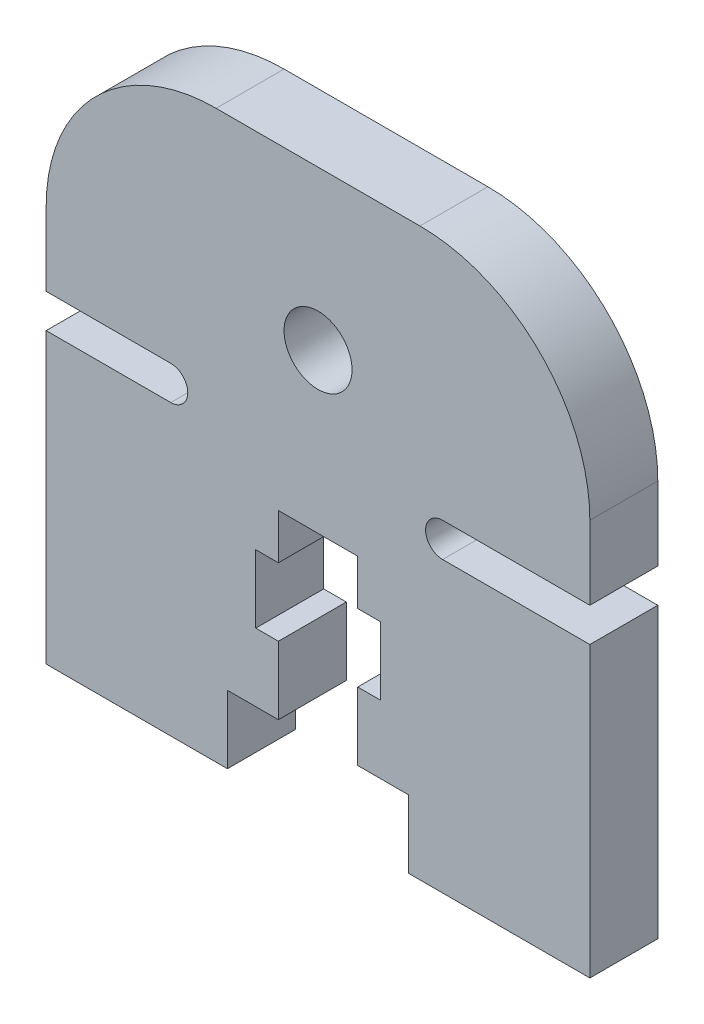
ISO-10303-21;
HEADER;
FILE_DESCRIPTION(('STEP AP214'),'2;1');
FILE_NAME('part.step','',(''),(''),'','','');
FILE_SCHEMA(('AUTOMOTIVE_DESIGN { 1 0 10303 214 1 1 1 1 }'));
ENDSEC;
DATA;
#1=APPLICATION_CONTEXT('core data for automotive mechanical design processes');
#2=APPLICATION_PROTOCOL_DEFINITION('international standard','automotive_design',2000,#1);
#3=PRODUCT_CONTEXT('',#1,'mechanical');
#4=PRODUCT('Part','Part','',(#3));
#5=PRODUCT_RELATED_PRODUCT_CATEGORY('part','',(#4));
#6=PRODUCT_DEFINITION_FORMATION('','',#4);
#7=PRODUCT_DEFINITION_CONTEXT('part definition',#1,'design');
#8=PRODUCT_DEFINITION('design','',#6,#7);
#9=PRODUCT_DEFINITION_SHAPE('','',#8);
#10=(LENGTH_UNIT() NAMED_UNIT(*) SI_UNIT(.MILLI.,.METRE.));
#11=(NAMED_UNIT(*) PLANE_ANGLE_UNIT() SI_UNIT($,.RADIAN.));
#12=(NAMED_UNIT(*) SI_UNIT($,.STERADIAN.) SOLID_ANGLE_UNIT());
#13=UNCERTAINTY_MEASURE_WITH_UNIT(LENGTH_MEASURE(1.E-05),#10,'distance_accuracy_value','');
#14=(GEOMETRIC_REPRESENTATION_CONTEXT(3) GLOBAL_UNCERTAINTY_ASSIGNED_CONTEXT((#13)) GLOBAL_UNIT_ASSIGNED_CONTEXT((#10,
#11,#12)) REPRESENTATION_CONTEXT('',''));
#15=CARTESIAN_POINT('',(0.,0.,0.));
#16=DIRECTION('',(0.,0.,1.));
#17=DIRECTION('',(1.,0.,0.));
#18=AXIS2_PLACEMENT_3D('',#15,#16,#17);
#19=CARTESIAN_POINT('',(0.,0.,3.));
#20=DIRECTION('',(0.,0.,-1.));
#21=DIRECTION('',(-1.,0.,0.));
#22=AXIS2_PLACEMENT_3D('',#19,#20,#21);
#23=PLANE('',#22);
#24=CARTESIAN_POINT('',(12.,18.,3.));
#25=DIRECTION('',(0.,0.,1.));
#26=DIRECTION('',(1.,0.,0.));
#27=AXIS2_PLACEMENT_3D('',#24,#25,#26);
#28=CIRCLE('',#27,1.5);
#29=CARTESIAN_POINT('',(13.5,18.,3.));
#30=VERTEX_POINT('',#29);
#31=EDGE_CURVE('E558',#30,#30,#28,.T.);
#32=ORIENTED_EDGE('',*,*,#31,.F.);
#33=EDGE_LOOP('',(#32));
#34=FACE_BOUND('',#33,.T.);
#35=DIRECTION('',(1.,0.,0.));
#36=VECTOR('',#35,1.);
#37=CARTESIAN_POINT('',(-5.5,14.25,3.));
#38=LINE('',#37,#36);
#39=CARTESIAN_POINT('',(0.,14.25,3.));
#40=VERTEX_POINT('',#39);
#41=CARTESIAN_POINT('',(5.5,14.25,3.));
#42=VERTEX_POINT('',#41);
#43=EDGE_CURVE('E238',#40,#42,#38,.T.);
#44=ORIENTED_EDGE('',*,*,#43,.T.);
#45=CARTESIAN_POINT('',(5.5,13.5,3.));
#46=DIRECTION('',(0.,0.,1.));
#47=DIRECTION('',(1.,0.,0.));
#48=AXIS2_PLACEMENT_3D('',#45,#46,#47);
#49=CIRCLE('',#48,0.750000000000001);
#50=CARTESIAN_POINT('',(5.5,12.75,3.));
#51=VERTEX_POINT('',#50);
#52=EDGE_CURVE('E251',#51,#42,#49,.T.);
#53=ORIENTED_EDGE('',*,*,#52,.F.);
#54=DIRECTION('',(1.,0.,0.));
#55=VECTOR('',#54,1.);
#56=CARTESIAN_POINT('',(-5.5,12.75,3.));
#57=LINE('',#56,#55);
#58=CARTESIAN_POINT('',(0.,12.75,3.));
#59=VERTEX_POINT('',#58);
#60=EDGE_CURVE('E360',#59,#51,#57,.T.);
#61=ORIENTED_EDGE('',*,*,#60,.F.);
#62=DIRECTION('',(0.,-1.,0.));
#63=VECTOR('',#62,1.);
#64=CARTESIAN_POINT('',(0.,0.,3.));
#65=LINE('',#64,#63);
#66=CARTESIAN_POINT('',(0.,0.,3.));
#67=VERTEX_POINT('',#66);
#68=EDGE_CURVE('E270',#59,#67,#65,.T.);
#69=ORIENTED_EDGE('',*,*,#68,.T.);
#70=DIRECTION('',(1.,0.,0.));
#71=VECTOR('',#70,1.);
#72=CARTESIAN_POINT('',(0.,0.,3.));
#73=LINE('',#72,#71);
#74=CARTESIAN_POINT('',(8.,0.,3.));
#75=VERTEX_POINT('',#74);
#76=EDGE_CURVE('E275',#67,#75,#73,.T.);
#77=ORIENTED_EDGE('',*,*,#76,.T.);
#78=DIRECTION('',(0.,1.,0.));
#79=VECTOR('',#78,1.);
#80=CARTESIAN_POINT('',(8.,0.,3.));
#81=LINE('',#80,#79);
#82=CARTESIAN_POINT('',(8.,3.,3.));
#83=VERTEX_POINT('',#82);
#84=EDGE_CURVE('E533',#75,#83,#81,.T.);
#85=ORIENTED_EDGE('',*,*,#84,.T.);
#86=DIRECTION('',(1.,0.,0.));
#87=VECTOR('',#86,1.);
#88=CARTESIAN_POINT('',(8.,3.,3.));
#89=LINE('',#88,#87);
#90=CARTESIAN_POINT('',(10.25,3.,3.));
#91=VERTEX_POINT('',#90);
#92=EDGE_CURVE('E538',#83,#91,#89,.T.);
#93=ORIENTED_EDGE('',*,*,#92,.T.);
#94=DIRECTION('',(0.,-1.,0.));
#95=VECTOR('',#94,1.);
#96=CARTESIAN_POINT('',(10.25,11.,3.));
#97=LINE('',#96,#95);
#98=CARTESIAN_POINT('',(10.25,6.,3.));
#99=VERTEX_POINT('',#98);
#100=EDGE_CURVE('E430',#99,#91,#97,.T.);
#101=ORIENTED_EDGE('',*,*,#100,.F.);
#102=DIRECTION('',(1.,0.,0.));
#103=VECTOR('',#102,1.);
#104=CARTESIAN_POINT('',(9.25,6.,3.));
#105=LINE('',#104,#103);
#106=CARTESIAN_POINT('',(9.25,6.,3.));
#107=VERTEX_POINT('',#106);
#108=EDGE_CURVE('E488',#107,#99,#105,.T.);
#109=ORIENTED_EDGE('',*,*,#108,.F.);
#110=DIRECTION('',(0.,-1.,0.));
#111=VECTOR('',#110,1.);
#112=CARTESIAN_POINT('',(9.25,9.,3.));
#113=LINE('',#112,#111);
#114=CARTESIAN_POINT('',(9.25,9.,3.));
#115=VERTEX_POINT('',#114);
#116=EDGE_CURVE('E484',#115,#107,#113,.T.);
#117=ORIENTED_EDGE('',*,*,#116,.F.);
#118=DIRECTION('',(-1.,0.,0.));
#119=VECTOR('',#118,1.);
#120=CARTESIAN_POINT('',(9.25,9.,3.));
#121=LINE('',#120,#119);
#122=CARTESIAN_POINT('',(10.25,9.,3.));
#123=VERTEX_POINT('',#122);
#124=EDGE_CURVE('E496',#123,#115,#121,.T.);
#125=ORIENTED_EDGE('',*,*,#124,.F.);
#126=DIRECTION('',(0.,-1.,0.));
#127=VECTOR('',#126,1.);
#128=CARTESIAN_POINT('',(10.25,11.,3.));
#129=LINE('',#128,#127);
#130=CARTESIAN_POINT('',(10.25,11.,3.));
#131=VERTEX_POINT('',#130);
#132=EDGE_CURVE('E447',#131,#123,#129,.T.);
#133=ORIENTED_EDGE('',*,*,#132,.F.);
#134=DIRECTION('',(1.,0.,0.));
#135=VECTOR('',#134,1.);
#136=CARTESIAN_POINT('',(10.25,11.,3.));
#137=LINE('',#136,#135);
#138=CARTESIAN_POINT('',(13.75,11.,3.));
#139=VERTEX_POINT('',#138);
#140=EDGE_CURVE('E411',#131,#139,#137,.T.);
#141=ORIENTED_EDGE('',*,*,#140,.T.);
#142=DIRECTION('',(0.,-1.,0.));
#143=VECTOR('',#142,1.);
#144=CARTESIAN_POINT('',(13.75,11.,3.));
#145=LINE('',#144,#143);
#146=CARTESIAN_POINT('',(13.75,9.,3.));
#147=VERTEX_POINT('',#146);
#148=EDGE_CURVE('E452',#139,#147,#145,.T.);
#149=ORIENTED_EDGE('',*,*,#148,.T.);
#150=CARTESIAN_POINT('',(14.75,9.,3.));
#151=VERTEX_POINT('',#150);
#152=EDGE_CURVE('E497',#151,#147,#121,.T.);
#153=ORIENTED_EDGE('',*,*,#152,.F.);
#154=DIRECTION('',(0.,1.,0.));
#155=VECTOR('',#154,1.);
#156=CARTESIAN_POINT('',(14.75,9.,3.));
#157=LINE('',#156,#155);
#158=CARTESIAN_POINT('',(14.75,6.,3.));
#159=VERTEX_POINT('',#158);
#160=EDGE_CURVE('E492',#159,#151,#157,.T.);
#161=ORIENTED_EDGE('',*,*,#160,.F.);
#162=CARTESIAN_POINT('',(13.75,6.,3.));
#163=VERTEX_POINT('',#162);
#164=EDGE_CURVE('E487',#163,#159,#105,.T.);
#165=ORIENTED_EDGE('',*,*,#164,.F.);
#166=DIRECTION('',(0.,-1.,0.));
#167=VECTOR('',#166,1.);
#168=CARTESIAN_POINT('',(13.75,11.,3.));
#169=LINE('',#168,#167);
#170=CARTESIAN_POINT('',(13.75,3.,3.));
#171=VERTEX_POINT('',#170);
#172=EDGE_CURVE('E433',#163,#171,#169,.T.);
#173=ORIENTED_EDGE('',*,*,#172,.T.);
#174=CARTESIAN_POINT('',(16.,3.,3.));
#175=VERTEX_POINT('',#174);
#176=EDGE_CURVE('E537',#171,#175,#89,.T.);
#177=ORIENTED_EDGE('',*,*,#176,.T.);
#178=DIRECTION('',(0.,1.,0.));
#179=VECTOR('',#178,1.);
#180=CARTESIAN_POINT('',(16.,0.,3.));
#181=LINE('',#180,#179);
#182=CARTESIAN_POINT('',(16.,0.,3.));
#183=VERTEX_POINT('',#182);
#184=EDGE_CURVE('E542',#183,#175,#181,.T.);
#185=ORIENTED_EDGE('',*,*,#184,.F.);
#186=CARTESIAN_POINT('',(24.,0.,3.));
#187=VERTEX_POINT('',#186);
#188=EDGE_CURVE('E269',#183,#187,#73,.T.);
#189=ORIENTED_EDGE('',*,*,#188,.T.);
#190=DIRECTION('',(0.,1.,0.));
#191=VECTOR('',#190,1.);
#192=CARTESIAN_POINT('',(24.,0.,3.));
#193=LINE('',#192,#191);
#194=CARTESIAN_POINT('',(24.,12.75,3.));
#195=VERTEX_POINT('',#194);
#196=EDGE_CURVE('E286',#187,#195,#193,.T.);
#197=ORIENTED_EDGE('',*,*,#196,.T.);
#198=DIRECTION('',(1.,0.,0.));
#199=VECTOR('',#198,1.);
#200=CARTESIAN_POINT('',(17.5,12.75,3.));
#201=LINE('',#200,#199);
#202=CARTESIAN_POINT('',(17.5,12.75,3.));
#203=VERTEX_POINT('',#202);
#204=EDGE_CURVE('E65',#203,#195,#201,.T.);
#205=ORIENTED_EDGE('',*,*,#204,.F.);
#206=CARTESIAN_POINT('',(17.5,13.5,3.));
#207=DIRECTION('',(0.,0.,1.));
#208=DIRECTION('',(1.,0.,0.));
#209=AXIS2_PLACEMENT_3D('',#206,#207,#208);
#210=CIRCLE('',#209,0.750000000000001);
#211=CARTESIAN_POINT('',(17.5,14.25,3.));
#212=VERTEX_POINT('',#211);
#213=EDGE_CURVE('E392',#212,#203,#210,.T.);
#214=ORIENTED_EDGE('',*,*,#213,.F.);
#215=DIRECTION('',(1.,0.,0.));
#216=VECTOR('',#215,1.);
#217=CARTESIAN_POINT('',(17.5,14.25,3.));
#218=LINE('',#217,#216);
#219=CARTESIAN_POINT('',(24.,14.25,3.));
#220=VERTEX_POINT('',#219);
#221=EDGE_CURVE('E398',#212,#220,#218,.T.);
#222=ORIENTED_EDGE('',*,*,#221,.T.);
#223=CARTESIAN_POINT('',(24.,17.5,3.));
#224=VERTEX_POINT('',#223);
#225=EDGE_CURVE('E285',#220,#224,#193,.T.);
#226=ORIENTED_EDGE('',*,*,#225,.T.);
#227=CARTESIAN_POINT('',(16.5,17.5,3.));
#228=DIRECTION('',(0.,0.,-1.));
#229=DIRECTION('',(-1.,0.,0.));
#230=AXIS2_PLACEMENT_3D('',#227,#228,#229);
#231=CIRCLE('',#230,7.5);
#232=CARTESIAN_POINT('',(16.5,25.,3.));
#233=VERTEX_POINT('',#232);
#234=EDGE_CURVE('E50',#224,#233,#231,.F.);
#235=ORIENTED_EDGE('',*,*,#234,.T.);
#236=DIRECTION('',(-1.,0.,0.));
#237=VECTOR('',#236,1.);
#238=CARTESIAN_POINT('',(0.,25.,3.));
#239=LINE('',#238,#237);
#240=CARTESIAN_POINT('',(7.5,25.,3.));
#241=VERTEX_POINT('',#240);
#242=EDGE_CURVE('E290',#233,#241,#239,.T.);
#243=ORIENTED_EDGE('',*,*,#242,.T.);
#244=CARTESIAN_POINT('',(7.5,17.5,3.));
#245=DIRECTION('',(0.,0.,-1.));
#246=DIRECTION('',(-1.,0.,0.));
#247=AXIS2_PLACEMENT_3D('',#244,#245,#246);
#248=CIRCLE('',#247,7.5);
#249=CARTESIAN_POINT('',(0.,17.5,3.));
#250=VERTEX_POINT('',#249);
#251=EDGE_CURVE('E267',#241,#250,#248,.F.);
#252=ORIENTED_EDGE('',*,*,#251,.T.);
#253=EDGE_CURVE('E257',#250,#40,#65,.T.);
#254=ORIENTED_EDGE('',*,*,#253,.T.);
#255=EDGE_LOOP('',(#44,#53,#61,#69,#77,#85,#93,#101,#109,#117,#125,#133,#141,#149,#153,#161,
#165,#173,#177,#185,#189,#197,#205,#214,#222,#226,#235,#243,#252,#254));
#256=FACE_BOUND('',#255,.T.);
#257=ADVANCED_FACE('F41',(#34,#256),#23,.F.);
#258=CARTESIAN_POINT('',(0.,0.,0.));
#259=DIRECTION('',(0.,0.,-1.));
#260=DIRECTION('',(-1.,0.,0.));
#261=AXIS2_PLACEMENT_3D('',#258,#259,#260);
#262=PLANE('',#261);
#263=CARTESIAN_POINT('',(12.,18.,0.));
#264=DIRECTION('',(0.,0.,-1.));
#265=DIRECTION('',(-1.,0.,0.));
#266=AXIS2_PLACEMENT_3D('',#263,#264,#265);
#267=CIRCLE('',#266,1.5);
#268=CARTESIAN_POINT('',(13.5,18.,0.));
#269=VERTEX_POINT('',#268);
#270=EDGE_CURVE('E280',#269,#269,#267,.F.);
#271=ORIENTED_EDGE('',*,*,#270,.T.);
#272=EDGE_LOOP('',(#271));
#273=FACE_BOUND('',#272,.T.);
#274=CARTESIAN_POINT('',(5.5,13.5,0.));
#275=DIRECTION('',(0.,0.,-1.));
#276=DIRECTION('',(-1.,0.,0.));
#277=AXIS2_PLACEMENT_3D('',#274,#275,#276);
#278=CIRCLE('',#277,0.750000000000001);
#279=CARTESIAN_POINT('',(5.5,12.75,0.));
#280=VERTEX_POINT('',#279);
#281=CARTESIAN_POINT('',(5.5,14.25,0.));
#282=VERTEX_POINT('',#281);
#283=EDGE_CURVE('E262',#280,#282,#278,.F.);
#284=ORIENTED_EDGE('',*,*,#283,.T.);
#285=DIRECTION('',(1.,0.,0.));
#286=VECTOR('',#285,1.);
#287=CARTESIAN_POINT('',(-5.5,14.25,0.));
#288=LINE('',#287,#286);
#289=CARTESIAN_POINT('',(0.,14.25,0.));
#290=VERTEX_POINT('',#289);
#291=EDGE_CURVE('E357',#290,#282,#288,.T.);
#292=ORIENTED_EDGE('',*,*,#291,.F.);
#293=DIRECTION('',(0.,-1.,0.));
#294=VECTOR('',#293,1.);
#295=CARTESIAN_POINT('',(0.,0.,0.));
#296=LINE('',#295,#294);
#297=CARTESIAN_POINT('',(0.,17.5,0.));
#298=VERTEX_POINT('',#297);
#299=EDGE_CURVE('E260',#298,#290,#296,.T.);
#300=ORIENTED_EDGE('',*,*,#299,.F.);
#301=CARTESIAN_POINT('',(7.5,17.5,0.));
#302=DIRECTION('',(0.,0.,-1.));
#303=DIRECTION('',(-1.,0.,0.));
#304=AXIS2_PLACEMENT_3D('',#301,#302,#303);
#305=CIRCLE('',#304,7.5);
#306=CARTESIAN_POINT('',(7.5,25.,0.));
#307=VERTEX_POINT('',#306);
#308=EDGE_CURVE('E324',#298,#307,#305,.T.);
#309=ORIENTED_EDGE('',*,*,#308,.T.);
#310=DIRECTION('',(-1.,0.,0.));
#311=VECTOR('',#310,1.);
#312=CARTESIAN_POINT('',(0.,25.,0.));
#313=LINE('',#312,#311);
#314=CARTESIAN_POINT('',(16.5,25.,0.));
#315=VERTEX_POINT('',#314);
#316=EDGE_CURVE('E278',#315,#307,#313,.T.);
#317=ORIENTED_EDGE('',*,*,#316,.F.);
#318=CARTESIAN_POINT('',(16.5,17.5,0.));
#319=DIRECTION('',(0.,0.,-1.));
#320=DIRECTION('',(-1.,0.,0.));
#321=AXIS2_PLACEMENT_3D('',#318,#319,#320);
#322=CIRCLE('',#321,7.5);
#323=CARTESIAN_POINT('',(24.,17.5,0.));
#324=VERTEX_POINT('',#323);
#325=EDGE_CURVE('E327',#315,#324,#322,.T.);
#326=ORIENTED_EDGE('',*,*,#325,.T.);
#327=DIRECTION('',(0.,1.,0.));
#328=VECTOR('',#327,1.);
#329=CARTESIAN_POINT('',(24.,0.,0.));
#330=LINE('',#329,#328);
#331=CARTESIAN_POINT('',(24.,14.25,0.));
#332=VERTEX_POINT('',#331);
#333=EDGE_CURVE('E302',#332,#324,#330,.T.);
#334=ORIENTED_EDGE('',*,*,#333,.F.);
#335=DIRECTION('',(1.,0.,0.));
#336=VECTOR('',#335,1.);
#337=CARTESIAN_POINT('',(17.5,14.25,0.));
#338=LINE('',#337,#336);
#339=CARTESIAN_POINT('',(17.5,14.25,0.));
#340=VERTEX_POINT('',#339);
#341=EDGE_CURVE('E389',#340,#332,#338,.T.);
#342=ORIENTED_EDGE('',*,*,#341,.F.);
#343=CARTESIAN_POINT('',(17.5,13.5,0.));
#344=DIRECTION('',(0.,0.,-1.));
#345=DIRECTION('',(-1.,0.,0.));
#346=AXIS2_PLACEMENT_3D('',#343,#344,#345);
#347=CIRCLE('',#346,0.750000000000001);
#348=CARTESIAN_POINT('',(17.5,12.75,0.));
#349=VERTEX_POINT('',#348);
#350=EDGE_CURVE('E385',#340,#349,#347,.F.);
#351=ORIENTED_EDGE('',*,*,#350,.T.);
#352=DIRECTION('',(1.,0.,0.));
#353=VECTOR('',#352,1.);
#354=CARTESIAN_POINT('',(17.5,12.75,0.));
#355=LINE('',#354,#353);
#356=CARTESIAN_POINT('',(24.,12.75,0.));
#357=VERTEX_POINT('',#356);
#358=EDGE_CURVE('E405',#349,#357,#355,.T.);
#359=ORIENTED_EDGE('',*,*,#358,.T.);
#360=CARTESIAN_POINT('',(24.,0.,0.));
#361=VERTEX_POINT('',#360);
#362=EDGE_CURVE('E303',#361,#357,#330,.T.);
#363=ORIENTED_EDGE('',*,*,#362,.F.);
#364=DIRECTION('',(1.,0.,0.));
#365=VECTOR('',#364,1.);
#366=CARTESIAN_POINT('',(0.,0.,0.));
#367=LINE('',#366,#365);
#368=CARTESIAN_POINT('',(16.,0.,0.));
#369=VERTEX_POINT('',#368);
#370=EDGE_CURVE('E296',#369,#361,#367,.T.);
#371=ORIENTED_EDGE('',*,*,#370,.F.);
#372=DIRECTION('',(0.,1.,0.));
#373=VECTOR('',#372,1.);
#374=CARTESIAN_POINT('',(16.,0.,0.));
#375=LINE('',#374,#373);
#376=CARTESIAN_POINT('',(16.,3.,0.));
#377=VERTEX_POINT('',#376);
#378=EDGE_CURVE('E521',#369,#377,#375,.T.);
#379=ORIENTED_EDGE('',*,*,#378,.T.);
#380=DIRECTION('',(1.,0.,0.));
#381=VECTOR('',#380,1.);
#382=CARTESIAN_POINT('',(8.,3.,0.));
#383=LINE('',#382,#381);
#384=CARTESIAN_POINT('',(13.75,3.,0.));
#385=VERTEX_POINT('',#384);
#386=EDGE_CURVE('E525',#385,#377,#383,.T.);
#387=ORIENTED_EDGE('',*,*,#386,.F.);
#388=DIRECTION('',(0.,-1.,0.));
#389=VECTOR('',#388,1.);
#390=CARTESIAN_POINT('',(13.75,11.,0.));
#391=LINE('',#390,#389);
#392=CARTESIAN_POINT('',(13.75,6.,0.));
#393=VERTEX_POINT('',#392);
#394=EDGE_CURVE('E437',#393,#385,#391,.T.);
#395=ORIENTED_EDGE('',*,*,#394,.F.);
#396=DIRECTION('',(1.,0.,0.));
#397=VECTOR('',#396,1.);
#398=CARTESIAN_POINT('',(9.25,6.,0.));
#399=LINE('',#398,#397);
#400=CARTESIAN_POINT('',(14.75,6.,0.));
#401=VERTEX_POINT('',#400);
#402=EDGE_CURVE('E506',#393,#401,#399,.T.);
#403=ORIENTED_EDGE('',*,*,#402,.T.);
#404=DIRECTION('',(0.,1.,0.));
#405=VECTOR('',#404,1.);
#406=CARTESIAN_POINT('',(14.75,9.,0.));
#407=LINE('',#406,#405);
#408=CARTESIAN_POINT('',(14.75,9.,0.));
#409=VERTEX_POINT('',#408);
#410=EDGE_CURVE('E440',#401,#409,#407,.T.);
#411=ORIENTED_EDGE('',*,*,#410,.T.);
#412=DIRECTION('',(-1.,0.,0.));
#413=VECTOR('',#412,1.);
#414=CARTESIAN_POINT('',(9.25,9.,0.));
#415=LINE('',#414,#413);
#416=CARTESIAN_POINT('',(13.75,9.,0.));
#417=VERTEX_POINT('',#416);
#418=EDGE_CURVE('E476',#409,#417,#415,.T.);
#419=ORIENTED_EDGE('',*,*,#418,.T.);
#420=DIRECTION('',(0.,-1.,0.));
#421=VECTOR('',#420,1.);
#422=CARTESIAN_POINT('',(13.75,11.,0.));
#423=LINE('',#422,#421);
#424=CARTESIAN_POINT('',(13.75,11.,0.));
#425=VERTEX_POINT('',#424);
#426=EDGE_CURVE('E445',#425,#417,#423,.T.);
#427=ORIENTED_EDGE('',*,*,#426,.F.);
#428=DIRECTION('',(1.,0.,0.));
#429=VECTOR('',#428,1.);
#430=CARTESIAN_POINT('',(10.25,11.,0.));
#431=LINE('',#430,#429);
#432=CARTESIAN_POINT('',(10.25,11.,0.));
#433=VERTEX_POINT('',#432);
#434=EDGE_CURVE('E457',#433,#425,#431,.T.);
#435=ORIENTED_EDGE('',*,*,#434,.F.);
#436=DIRECTION('',(0.,-1.,0.));
#437=VECTOR('',#436,1.);
#438=CARTESIAN_POINT('',(10.25,11.,0.));
#439=LINE('',#438,#437);
#440=CARTESIAN_POINT('',(10.25,9.,0.));
#441=VERTEX_POINT('',#440);
#442=EDGE_CURVE('E441',#433,#441,#439,.T.);
#443=ORIENTED_EDGE('',*,*,#442,.T.);
#444=CARTESIAN_POINT('',(9.25,9.,0.));
#445=VERTEX_POINT('',#444);
#446=EDGE_CURVE('E475',#441,#445,#415,.T.);
#447=ORIENTED_EDGE('',*,*,#446,.T.);
#448=DIRECTION('',(0.,-1.,0.));
#449=VECTOR('',#448,1.);
#450=CARTESIAN_POINT('',(9.25,9.,0.));
#451=LINE('',#450,#449);
#452=CARTESIAN_POINT('',(9.25,6.,0.));
#453=VERTEX_POINT('',#452);
#454=EDGE_CURVE('E480',#445,#453,#451,.T.);
#455=ORIENTED_EDGE('',*,*,#454,.T.);
#456=CARTESIAN_POINT('',(10.25,6.,0.));
#457=VERTEX_POINT('',#456);
#458=EDGE_CURVE('E517',#453,#457,#399,.T.);
#459=ORIENTED_EDGE('',*,*,#458,.T.);
#460=DIRECTION('',(0.,-1.,0.));
#461=VECTOR('',#460,1.);
#462=CARTESIAN_POINT('',(10.25,11.,0.));
#463=LINE('',#462,#461);
#464=CARTESIAN_POINT('',(10.25,3.,0.));
#465=VERTEX_POINT('',#464);
#466=EDGE_CURVE('E426',#457,#465,#463,.T.);
#467=ORIENTED_EDGE('',*,*,#466,.T.);
#468=CARTESIAN_POINT('',(8.,3.,0.));
#469=VERTEX_POINT('',#468);
#470=EDGE_CURVE('E526',#469,#465,#383,.T.);
#471=ORIENTED_EDGE('',*,*,#470,.F.);
#472=DIRECTION('',(0.,1.,0.));
#473=VECTOR('',#472,1.);
#474=CARTESIAN_POINT('',(8.,0.,0.));
#475=LINE('',#474,#473);
#476=CARTESIAN_POINT('',(8.,0.,0.));
#477=VERTEX_POINT('',#476);
#478=EDGE_CURVE('E530',#477,#469,#475,.T.);
#479=ORIENTED_EDGE('',*,*,#478,.F.);
#480=CARTESIAN_POINT('',(0.,0.,0.));
#481=VERTEX_POINT('',#480);
#482=EDGE_CURVE('E298',#481,#477,#367,.T.);
#483=ORIENTED_EDGE('',*,*,#482,.F.);
#484=CARTESIAN_POINT('',(0.,12.75,0.));
#485=VERTEX_POINT('',#484);
#486=EDGE_CURVE('E297',#485,#481,#296,.T.);
#487=ORIENTED_EDGE('',*,*,#486,.F.);
#488=DIRECTION('',(1.,0.,0.));
#489=VECTOR('',#488,1.);
#490=CARTESIAN_POINT('',(-5.5,12.75,0.));
#491=LINE('',#490,#489);
#492=EDGE_CURVE('E57',#485,#280,#491,.T.);
#493=ORIENTED_EDGE('',*,*,#492,.T.);
#494=EDGE_LOOP('',(#284,#292,#300,#309,#317,#326,#334,#342,#351,#359,#363,#371,#379,#387,#395,
#403,#411,#419,#427,#435,#443,#447,#455,#459,#467,#471,#479,#483,#487,#493));
#495=FACE_BOUND('',#494,.T.);
#496=ADVANCED_FACE('F354',(#273,#495),#262,.T.);
#497=CARTESIAN_POINT('',(0.,0.,3.));
#498=DIRECTION('',(1.,0.,0.));
#499=DIRECTION('',(0.,0.,-1.));
#500=AXIS2_PLACEMENT_3D('',#497,#498,#499);
#501=PLANE('',#500);
#502=DIRECTION('',(0.,0.,1.));
#503=VECTOR('',#502,1.);
#504=CARTESIAN_POINT('',(0.,14.25,-0.00100000000000013));
#505=LINE('',#504,#503);
#506=EDGE_CURVE('E242',#290,#40,#505,.T.);
#507=ORIENTED_EDGE('',*,*,#506,.T.);
#508=ORIENTED_EDGE('',*,*,#253,.F.);
#509=DIRECTION('',(0.,0.,-1.));
#510=VECTOR('',#509,1.);
#511=CARTESIAN_POINT('',(0.,17.5,3.));
#512=LINE('',#511,#510);
#513=EDGE_CURVE('E11',#250,#298,#512,.T.);
#514=ORIENTED_EDGE('',*,*,#513,.T.);
#515=ORIENTED_EDGE('',*,*,#299,.T.);
#516=EDGE_LOOP('',(#507,#508,#514,#515));
#517=FACE_BOUND('',#516,.T.);
#518=ADVANCED_FACE('F256',(#517),#501,.F.);
#519=CARTESIAN_POINT('',(24.,0.,3.));
#520=DIRECTION('',(-1.,0.,0.));
#521=DIRECTION('',(0.,0.,1.));
#522=AXIS2_PLACEMENT_3D('',#519,#520,#521);
#523=PLANE('',#522);
#524=DIRECTION('',(0.,0.,-1.));
#525=VECTOR('',#524,1.);
#526=CARTESIAN_POINT('',(24.,14.25,-0.00100000000000013));
#527=LINE('',#526,#525);
#528=EDGE_CURVE('E381',#220,#332,#527,.T.);
#529=ORIENTED_EDGE('',*,*,#528,.T.);
#530=ORIENTED_EDGE('',*,*,#333,.T.);
#531=DIRECTION('',(0.,0.,-1.));
#532=VECTOR('',#531,1.);
#533=CARTESIAN_POINT('',(24.,17.5,3.));
#534=LINE('',#533,#532);
#535=EDGE_CURVE('E331',#324,#224,#534,.F.);
#536=ORIENTED_EDGE('',*,*,#535,.T.);
#537=ORIENTED_EDGE('',*,*,#225,.F.);
#538=EDGE_LOOP('',(#529,#530,#536,#537));
#539=FACE_BOUND('',#538,.T.);
#540=ADVANCED_FACE('F595',(#539),#523,.F.);
#541=CARTESIAN_POINT('',(8.,3.,-0.00100000000000013));
#542=DIRECTION('',(0.,-1.,0.));
#543=DIRECTION('',(0.,0.,-1.));
#544=AXIS2_PLACEMENT_3D('',#541,#542,#543);
#545=PLANE('',#544);
#546=ORIENTED_EDGE('',*,*,#176,.F.);
#547=DIRECTION('',(0.,0.,1.));
#548=VECTOR('',#547,1.);
#549=CARTESIAN_POINT('',(13.75,3.,-0.00100000000000013));
#550=LINE('',#549,#548);
#551=EDGE_CURVE('E420',#385,#171,#550,.T.);
#552=ORIENTED_EDGE('',*,*,#551,.F.);
#553=ORIENTED_EDGE('',*,*,#386,.T.);
#554=DIRECTION('',(0.,0.,1.));
#555=VECTOR('',#554,1.);
#556=CARTESIAN_POINT('',(16.,3.,-0.00100000000000013));
#557=LINE('',#556,#555);
#558=EDGE_CURVE('E552',#377,#175,#557,.T.);
#559=ORIENTED_EDGE('',*,*,#558,.T.);
#560=EDGE_LOOP('',(#546,#552,#553,#559));
#561=FACE_BOUND('',#560,.T.);
#562=ADVANCED_FACE('F632',(#561),#545,.T.);
#563=CARTESIAN_POINT('',(9.25,9.,-0.00100000000000013));
#564=DIRECTION('',(0.,1.,0.));
#565=DIRECTION('',(0.,0.,1.));
#566=AXIS2_PLACEMENT_3D('',#563,#564,#565);
#567=PLANE('',#566);
#568=DIRECTION('',(0.,0.,-1.));
#569=VECTOR('',#568,1.);
#570=CARTESIAN_POINT('',(13.75,9.,-0.00100000000000013));
#571=LINE('',#570,#569);
#572=EDGE_CURVE('E450',#147,#417,#571,.T.);
#573=ORIENTED_EDGE('',*,*,#572,.T.);
#574=ORIENTED_EDGE('',*,*,#418,.F.);
#575=DIRECTION('',(0.,0.,1.));
#576=VECTOR('',#575,1.);
#577=CARTESIAN_POINT('',(14.75,9.,-0.00100000000000013));
#578=LINE('',#577,#576);
#579=EDGE_CURVE('E507',#409,#151,#578,.T.);
#580=ORIENTED_EDGE('',*,*,#579,.T.);
#581=ORIENTED_EDGE('',*,*,#152,.T.);
#582=EDGE_LOOP('',(#573,#574,#580,#581));
#583=FACE_BOUND('',#582,.T.);
#584=ADVANCED_FACE('F661',(#583),#567,.F.);
#585=CARTESIAN_POINT('',(9.25,6.,-0.00100000000000013));
#586=DIRECTION('',(0.,-1.,0.));
#587=DIRECTION('',(0.,0.,-1.));
#588=AXIS2_PLACEMENT_3D('',#585,#586,#587);
#589=PLANE('',#588);
#590=DIRECTION('',(0.,0.,1.));
#591=VECTOR('',#590,1.);
#592=CARTESIAN_POINT('',(13.75,6.,-0.00100000000000013));
#593=LINE('',#592,#591);
#594=EDGE_CURVE('E412',#393,#163,#593,.T.);
#595=ORIENTED_EDGE('',*,*,#594,.T.);
#596=ORIENTED_EDGE('',*,*,#164,.T.);
#597=DIRECTION('',(0.,0.,1.));
#598=VECTOR('',#597,1.);
#599=CARTESIAN_POINT('',(14.75,6.,-0.00100000000000013));
#600=LINE('',#599,#598);
#601=EDGE_CURVE('E510',#401,#159,#600,.T.);
#602=ORIENTED_EDGE('',*,*,#601,.F.);
#603=ORIENTED_EDGE('',*,*,#402,.F.);
#604=EDGE_LOOP('',(#595,#596,#602,#603));
#605=FACE_BOUND('',#604,.T.);
#606=ADVANCED_FACE('F680',(#605),#589,.F.);
#607=CARTESIAN_POINT('',(0.,0.,3.));
#608=DIRECTION('',(0.,1.,0.));
#609=DIRECTION('',(0.,0.,1.));
#610=AXIS2_PLACEMENT_3D('',#607,#608,#609);
#611=PLANE('',#610);
#612=DIRECTION('',(0.,0.,1.));
#613=VECTOR('',#612,1.);
#614=CARTESIAN_POINT('',(8.,0.,-0.00100000000000013));
#615=LINE('',#614,#613);
#616=EDGE_CURVE('E545',#477,#75,#615,.T.);
#617=ORIENTED_EDGE('',*,*,#616,.T.);
#618=ORIENTED_EDGE('',*,*,#76,.F.);
#619=DIRECTION('',(0.,0.,-1.));
#620=VECTOR('',#619,1.);
#621=CARTESIAN_POINT('',(0.,0.,3.));
#622=LINE('',#621,#620);
#623=EDGE_CURVE('E313',#67,#481,#622,.T.);
#624=ORIENTED_EDGE('',*,*,#623,.T.);
#625=ORIENTED_EDGE('',*,*,#482,.T.);
#626=EDGE_LOOP('',(#617,#618,#624,#625));
#627=FACE_BOUND('',#626,.T.);
#628=ADVANCED_FACE('F600',(#627),#611,.F.);
#629=ORIENTED_EDGE('',*,*,#68,.F.);
#630=DIRECTION('',(0.,0.,1.));
#631=VECTOR('',#630,1.);
#632=CARTESIAN_POINT('',(0.,12.75,-0.00100000000000013));
#633=LINE('',#632,#631);
#634=EDGE_CURVE('E263',#485,#59,#633,.T.);
#635=ORIENTED_EDGE('',*,*,#634,.F.);
#636=ORIENTED_EDGE('',*,*,#486,.T.);
#637=ORIENTED_EDGE('',*,*,#623,.F.);
#638=EDGE_LOOP('',(#629,#635,#636,#637));
#639=FACE_BOUND('',#638,.T.);
#640=ADVANCED_FACE('F598',(#639),#501,.F.);
#641=ORIENTED_EDGE('',*,*,#188,.F.);
#642=DIRECTION('',(0.,0.,1.));
#643=VECTOR('',#642,1.);
#644=CARTESIAN_POINT('',(16.,0.,-0.00100000000000013));
#645=LINE('',#644,#643);
#646=EDGE_CURVE('E549',#369,#183,#645,.T.);
#647=ORIENTED_EDGE('',*,*,#646,.F.);
#648=ORIENTED_EDGE('',*,*,#370,.T.);
#649=DIRECTION('',(0.,0.,-1.));
#650=VECTOR('',#649,1.);
#651=CARTESIAN_POINT('',(24.,0.,3.));
#652=LINE('',#651,#650);
#653=EDGE_CURVE('E293',#187,#361,#652,.T.);
#654=ORIENTED_EDGE('',*,*,#653,.F.);
#655=EDGE_LOOP('',(#641,#647,#648,#654));
#656=FACE_BOUND('',#655,.T.);
#657=ADVANCED_FACE('F593',(#656),#611,.F.);
#658=ORIENTED_EDGE('',*,*,#362,.T.);
#659=DIRECTION('',(0.,0.,-1.));
#660=VECTOR('',#659,1.);
#661=CARTESIAN_POINT('',(24.,12.75,-0.00100000000000013));
#662=LINE('',#661,#660);
#663=EDGE_CURVE('E378',#195,#357,#662,.T.);
#664=ORIENTED_EDGE('',*,*,#663,.F.);
#665=ORIENTED_EDGE('',*,*,#196,.F.);
#666=ORIENTED_EDGE('',*,*,#653,.T.);
#667=EDGE_LOOP('',(#658,#664,#665,#666));
#668=FACE_BOUND('',#667,.T.);
#669=ADVANCED_FACE('F590',(#668),#523,.F.);
#670=CARTESIAN_POINT('',(0.,25.,3.));
#671=DIRECTION('',(0.,-1.,0.));
#672=DIRECTION('',(0.,0.,-1.));
#673=AXIS2_PLACEMENT_3D('',#670,#671,#672);
#674=PLANE('',#673);
#675=ORIENTED_EDGE('',*,*,#242,.F.);
#676=DIRECTION('',(0.,0.,-1.));
#677=VECTOR('',#676,1.);
#678=CARTESIAN_POINT('',(16.5,25.,3.));
#679=LINE('',#678,#677);
#680=EDGE_CURVE('E320',#233,#315,#679,.T.);
#681=ORIENTED_EDGE('',*,*,#680,.T.);
#682=ORIENTED_EDGE('',*,*,#316,.T.);
#683=DIRECTION('',(0.,0.,-1.));
#684=VECTOR('',#683,1.);
#685=CARTESIAN_POINT('',(7.5,25.,3.));
#686=LINE('',#685,#684);
#687=EDGE_CURVE('E317',#307,#241,#686,.F.);
#688=ORIENTED_EDGE('',*,*,#687,.T.);
#689=EDGE_LOOP('',(#675,#681,#682,#688));
#690=FACE_BOUND('',#689,.T.);
#691=ADVANCED_FACE('F347',(#690),#674,.F.);
#692=CARTESIAN_POINT('',(16.5,17.5,3.));
#693=DIRECTION('',(0.,0.,-1.));
#694=DIRECTION('',(-1.,0.,0.));
#695=AXIS2_PLACEMENT_3D('',#692,#693,#694);
#696=CYLINDRICAL_SURFACE('',#695,7.5);
#697=ORIENTED_EDGE('',*,*,#234,.F.);
#698=ORIENTED_EDGE('',*,*,#535,.F.);
#699=ORIENTED_EDGE('',*,*,#325,.F.);
#700=ORIENTED_EDGE('',*,*,#680,.F.);
#701=EDGE_LOOP('',(#697,#698,#699,#700));
#702=FACE_BOUND('',#701,.T.);
#703=ADVANCED_FACE('F350',(#702),#696,.T.);
#704=CARTESIAN_POINT('',(7.5,17.5,3.));
#705=DIRECTION('',(0.,0.,-1.));
#706=DIRECTION('',(-1.,0.,0.));
#707=AXIS2_PLACEMENT_3D('',#704,#705,#706);
#708=CYLINDRICAL_SURFACE('',#707,7.5);
#709=ORIENTED_EDGE('',*,*,#251,.F.);
#710=ORIENTED_EDGE('',*,*,#687,.F.);
#711=ORIENTED_EDGE('',*,*,#308,.F.);
#712=ORIENTED_EDGE('',*,*,#513,.F.);
#713=EDGE_LOOP('',(#709,#710,#711,#712));
#714=FACE_BOUND('',#713,.T.);
#715=ADVANCED_FACE('F43',(#714),#708,.T.);
#716=CARTESIAN_POINT('',(12.,18.,-0.00100000000000013));
#717=DIRECTION('',(0.,0.,1.));
#718=DIRECTION('',(1.,0.,0.));
#719=AXIS2_PLACEMENT_3D('',#716,#717,#718);
#720=CYLINDRICAL_SURFACE('',#719,1.5);
#721=CARTESIAN_POINT('',(13.5,18.,0.));
#722=CARTESIAN_POINT('',(13.5,18.,0.03125));
#723=CARTESIAN_POINT('',(13.5,18.,0.0625));
#724=CARTESIAN_POINT('',(13.5,18.,0.125));
#725=CARTESIAN_POINT('',(13.5,18.,0.15625));
#726=CARTESIAN_POINT('',(13.5,18.,0.21875));
#727=CARTESIAN_POINT('',(13.5,18.,0.25));
#728=CARTESIAN_POINT('',(13.5,18.,0.3125));
#729=CARTESIAN_POINT('',(13.5,18.,0.34375));
#730=CARTESIAN_POINT('',(13.5,18.,0.40625));
#731=CARTESIAN_POINT('',(13.5,18.,0.4375));
#732=CARTESIAN_POINT('',(13.5,18.,0.5));
#733=CARTESIAN_POINT('',(13.5,18.,0.53125));
#734=CARTESIAN_POINT('',(13.5,18.,0.59375));
#735=CARTESIAN_POINT('',(13.5,18.,0.625));
#736=CARTESIAN_POINT('',(13.5,18.,0.6875));
#737=CARTESIAN_POINT('',(13.5,18.,0.71875));
#738=CARTESIAN_POINT('',(13.5,18.,0.78125));
#739=CARTESIAN_POINT('',(13.5,18.,0.8125));
#740=CARTESIAN_POINT('',(13.5,18.,0.875));
#741=CARTESIAN_POINT('',(13.5,18.,0.90625));
#742=CARTESIAN_POINT('',(13.5,18.,0.96875));
#743=CARTESIAN_POINT('',(13.5,18.,1.));
#744=CARTESIAN_POINT('',(13.5,18.,1.0625));
#745=CARTESIAN_POINT('',(13.5,18.,1.09375));
#746=CARTESIAN_POINT('',(13.5,18.,1.15625));
#747=CARTESIAN_POINT('',(13.5,18.,1.1875));
#748=CARTESIAN_POINT('',(13.5,18.,1.25));
#749=CARTESIAN_POINT('',(13.5,18.,1.28125));
#750=CARTESIAN_POINT('',(13.5,18.,1.34375));
#751=CARTESIAN_POINT('',(13.5,18.,1.375));
#752=CARTESIAN_POINT('',(13.5,18.,1.4375));
#753=CARTESIAN_POINT('',(13.5,18.,1.46875));
#754=CARTESIAN_POINT('',(13.5,18.,1.53125));
#755=CARTESIAN_POINT('',(13.5,18.,1.5625));
#756=CARTESIAN_POINT('',(13.5,18.,1.625));
#757=CARTESIAN_POINT('',(13.5,18.,1.65625));
#758=CARTESIAN_POINT('',(13.5,18.,1.71875));
#759=CARTESIAN_POINT('',(13.5,18.,1.75));
#760=CARTESIAN_POINT('',(13.5,18.,1.8125));
#761=CARTESIAN_POINT('',(13.5,18.,1.84375));
#762=CARTESIAN_POINT('',(13.5,18.,1.90625));
#763=CARTESIAN_POINT('',(13.5,18.,1.9375));
#764=CARTESIAN_POINT('',(13.5,18.,2.));
#765=CARTESIAN_POINT('',(13.5,18.,2.03125));
#766=CARTESIAN_POINT('',(13.5,18.,2.09375));
#767=CARTESIAN_POINT('',(13.5,18.,2.125));
#768=CARTESIAN_POINT('',(13.5,18.,2.1875));
#769=CARTESIAN_POINT('',(13.5,18.,2.21875));
#770=CARTESIAN_POINT('',(13.5,18.,2.28125));
#771=CARTESIAN_POINT('',(13.5,18.,2.3125));
#772=CARTESIAN_POINT('',(13.5,18.,2.375));
#773=CARTESIAN_POINT('',(13.5,18.,2.40625));
#774=CARTESIAN_POINT('',(13.5,18.,2.46875));
#775=CARTESIAN_POINT('',(13.5,18.,2.5));
#776=CARTESIAN_POINT('',(13.5,18.,2.5625));
#777=CARTESIAN_POINT('',(13.5,18.,2.59375));
#778=CARTESIAN_POINT('',(13.5,18.,2.65625));
#779=CARTESIAN_POINT('',(13.5,18.,2.6875));
#780=CARTESIAN_POINT('',(13.5,18.,2.75));
#781=CARTESIAN_POINT('',(13.5,18.,2.78125));
#782=CARTESIAN_POINT('',(13.5,18.,2.84375));
#783=CARTESIAN_POINT('',(13.5,18.,2.875));
#784=CARTESIAN_POINT('',(13.5,18.,2.9375));
#785=CARTESIAN_POINT('',(13.5,18.,2.96875));
#786=CARTESIAN_POINT('',(13.5,18.,3.));
#787=B_SPLINE_CURVE_WITH_KNOTS('',3,(#721,#722,#723,#724,#725,#726,#727,#728,#729,#730,#731,
#732,#733,#734,#735,#736,#737,#738,#739,#740,#741,#742,#743,#744,#745,#746,#747,#748,#749,#750,
#751,#752,#753,#754,#755,#756,#757,#758,#759,#760,#761,#762,#763,#764,#765,#766,#767,#768,#769,
#770,#771,#772,#773,#774,#775,#776,#777,#778,#779,#780,#781,#782,#783,#784,#785,#786),
.UNSPECIFIED.,.F.,.F.,(4,2,2,2,2,2,2,2,2,2,2,2,2,2,2,2,2,2,2,2,2,2,2,2,2,2,2,2,2,2,2,2,4),(0.,
0.09375,0.1875,0.28125,0.375,0.46875,0.5625,0.65625,0.75,0.84375,0.9375,1.03125,1.125,1.21875,
1.3125,1.40625,1.5,1.59375,1.6875,1.78125,1.875,1.96875,2.0625,2.15625,2.25,2.34375,2.4375,
2.53125,2.625,2.71875,2.8125,2.90625,3.),.UNSPECIFIED.);
#788=EDGE_CURVE('BSEAM569',#269,#30,#787,.T.);
#789=ORIENTED_EDGE('',*,*,#270,.F.);
#790=ORIENTED_EDGE('',*,*,#31,.T.);
#791=ORIENTED_EDGE('',*,*,#788,.T.);
#792=ORIENTED_EDGE('',*,*,#788,.F.);
#793=EDGE_LOOP('',(#789,#791,#790,#792));
#794=FACE_BOUND('',#793,.T.);
#795=ADVANCED_FACE('F569',(#794),#720,.F.);
#796=CARTESIAN_POINT('',(8.,0.,-0.00100000000000013));
#797=DIRECTION('',(1.,0.,0.));
#798=DIRECTION('',(0.,0.,-1.));
#799=AXIS2_PLACEMENT_3D('',#796,#797,#798);
#800=PLANE('',#799);
#801=ORIENTED_EDGE('',*,*,#478,.T.);
#802=DIRECTION('',(0.,0.,1.));
#803=VECTOR('',#802,1.);
#804=CARTESIAN_POINT('',(8.,3.,-0.00100000000000013));
#805=LINE('',#804,#803);
#806=EDGE_CURVE('E556',#469,#83,#805,.T.);
#807=ORIENTED_EDGE('',*,*,#806,.T.);
#808=ORIENTED_EDGE('',*,*,#84,.F.);
#809=ORIENTED_EDGE('',*,*,#616,.F.);
#810=EDGE_LOOP('',(#801,#807,#808,#809));
#811=FACE_BOUND('',#810,.T.);
#812=ADVANCED_FACE('F571',(#811),#800,.T.);
#813=DIRECTION('',(0.,0.,1.));
#814=VECTOR('',#813,1.);
#815=CARTESIAN_POINT('',(10.25,3.,-0.00100000000000013));
#816=LINE('',#815,#814);
#817=EDGE_CURVE('E422',#465,#91,#816,.T.);
#818=ORIENTED_EDGE('',*,*,#817,.T.);
#819=ORIENTED_EDGE('',*,*,#92,.F.);
#820=ORIENTED_EDGE('',*,*,#806,.F.);
#821=ORIENTED_EDGE('',*,*,#470,.T.);
#822=EDGE_LOOP('',(#818,#819,#820,#821));
#823=FACE_BOUND('',#822,.T.);
#824=ADVANCED_FACE('F577',(#823),#545,.T.);
#825=CARTESIAN_POINT('',(16.,0.,-0.00100000000000013));
#826=DIRECTION('',(1.,0.,0.));
#827=DIRECTION('',(0.,0.,-1.));
#828=AXIS2_PLACEMENT_3D('',#825,#826,#827);
#829=PLANE('',#828);
#830=ORIENTED_EDGE('',*,*,#646,.T.);
#831=ORIENTED_EDGE('',*,*,#184,.T.);
#832=ORIENTED_EDGE('',*,*,#558,.F.);
#833=ORIENTED_EDGE('',*,*,#378,.F.);
#834=EDGE_LOOP('',(#830,#831,#832,#833));
#835=FACE_BOUND('',#834,.T.);
#836=ADVANCED_FACE('F629',(#835),#829,.F.);
#837=CARTESIAN_POINT('',(9.25,9.,-0.00100000000000013));
#838=DIRECTION('',(-1.,0.,0.));
#839=DIRECTION('',(0.,0.,1.));
#840=AXIS2_PLACEMENT_3D('',#837,#838,#839);
#841=PLANE('',#840);
#842=DIRECTION('',(0.,0.,1.));
#843=VECTOR('',#842,1.);
#844=CARTESIAN_POINT('',(9.25,9.,-0.00100000000000013));
#845=LINE('',#844,#843);
#846=EDGE_CURVE('E502',#445,#115,#845,.T.);
#847=ORIENTED_EDGE('',*,*,#846,.T.);
#848=ORIENTED_EDGE('',*,*,#116,.T.);
#849=DIRECTION('',(0.,0.,1.));
#850=VECTOR('',#849,1.);
#851=CARTESIAN_POINT('',(9.25,6.,-0.00100000000000013));
#852=LINE('',#851,#850);
#853=EDGE_CURVE('E501',#453,#107,#852,.T.);
#854=ORIENTED_EDGE('',*,*,#853,.F.);
#855=ORIENTED_EDGE('',*,*,#454,.F.);
#856=EDGE_LOOP('',(#847,#848,#854,#855));
#857=FACE_BOUND('',#856,.T.);
#858=ADVANCED_FACE('F640',(#857),#841,.F.);
#859=ORIENTED_EDGE('',*,*,#446,.F.);
#860=DIRECTION('',(0.,0.,-1.));
#861=VECTOR('',#860,1.);
#862=CARTESIAN_POINT('',(10.25,9.,-0.00100000000000013));
#863=LINE('',#862,#861);
#864=EDGE_CURVE('E417',#123,#441,#863,.T.);
#865=ORIENTED_EDGE('',*,*,#864,.F.);
#866=ORIENTED_EDGE('',*,*,#124,.T.);
#867=ORIENTED_EDGE('',*,*,#846,.F.);
#868=EDGE_LOOP('',(#859,#865,#866,#867));
#869=FACE_BOUND('',#868,.T.);
#870=ADVANCED_FACE('F649',(#869),#567,.F.);
#871=CARTESIAN_POINT('',(14.75,9.,-0.00100000000000013));
#872=DIRECTION('',(1.,0.,0.));
#873=DIRECTION('',(0.,1.,0.));
#874=AXIS2_PLACEMENT_3D('',#871,#872,#873);
#875=PLANE('',#874);
#876=ORIENTED_EDGE('',*,*,#601,.T.);
#877=ORIENTED_EDGE('',*,*,#160,.T.);
#878=ORIENTED_EDGE('',*,*,#579,.F.);
#879=ORIENTED_EDGE('',*,*,#410,.F.);
#880=EDGE_LOOP('',(#876,#877,#878,#879));
#881=FACE_BOUND('',#880,.T.);
#882=ADVANCED_FACE('F658',(#881),#875,.F.);
#883=ORIENTED_EDGE('',*,*,#108,.T.);
#884=DIRECTION('',(0.,0.,1.));
#885=VECTOR('',#884,1.);
#886=CARTESIAN_POINT('',(10.25,6.,-0.00100000000000013));
#887=LINE('',#886,#885);
#888=EDGE_CURVE('E416',#457,#99,#887,.T.);
#889=ORIENTED_EDGE('',*,*,#888,.F.);
#890=ORIENTED_EDGE('',*,*,#458,.F.);
#891=ORIENTED_EDGE('',*,*,#853,.T.);
#892=EDGE_LOOP('',(#883,#889,#890,#891));
#893=FACE_BOUND('',#892,.T.);
#894=ADVANCED_FACE('F668',(#893),#589,.F.);
#895=CARTESIAN_POINT('',(10.25,11.,-0.00100000000000013));
#896=DIRECTION('',(-1.,0.,0.));
#897=DIRECTION('',(0.,-1.,0.));
#898=AXIS2_PLACEMENT_3D('',#895,#896,#897);
#899=PLANE('',#898);
#900=ORIENTED_EDGE('',*,*,#466,.F.);
#901=ORIENTED_EDGE('',*,*,#888,.T.);
#902=ORIENTED_EDGE('',*,*,#100,.T.);
#903=ORIENTED_EDGE('',*,*,#817,.F.);
#904=EDGE_LOOP('',(#900,#901,#902,#903));
#905=FACE_BOUND('',#904,.T.);
#906=ADVANCED_FACE('F677',(#905),#899,.F.);
#907=CARTESIAN_POINT('',(13.75,11.,-0.00100000000000013));
#908=DIRECTION('',(-1.,0.,0.));
#909=DIRECTION('',(0.,0.,1.));
#910=AXIS2_PLACEMENT_3D('',#907,#908,#909);
#911=PLANE('',#910);
#912=ORIENTED_EDGE('',*,*,#551,.T.);
#913=ORIENTED_EDGE('',*,*,#172,.F.);
#914=ORIENTED_EDGE('',*,*,#594,.F.);
#915=ORIENTED_EDGE('',*,*,#394,.T.);
#916=EDGE_LOOP('',(#912,#913,#914,#915));
#917=FACE_BOUND('',#916,.T.);
#918=ADVANCED_FACE('F687',(#917),#911,.T.);
#919=CARTESIAN_POINT('',(10.25,11.,-0.00100000000000013));
#920=DIRECTION('',(-1.,0.,0.));
#921=DIRECTION('',(0.,-1.,0.));
#922=AXIS2_PLACEMENT_3D('',#919,#920,#921);
#923=PLANE('',#922);
#924=DIRECTION('',(0.,0.,1.));
#925=VECTOR('',#924,1.);
#926=CARTESIAN_POINT('',(10.25,11.,-0.00100000000000013));
#927=LINE('',#926,#925);
#928=EDGE_CURVE('E451',#433,#131,#927,.T.);
#929=ORIENTED_EDGE('',*,*,#928,.T.);
#930=ORIENTED_EDGE('',*,*,#132,.T.);
#931=ORIENTED_EDGE('',*,*,#864,.T.);
#932=ORIENTED_EDGE('',*,*,#442,.F.);
#933=EDGE_LOOP('',(#929,#930,#931,#932));
#934=FACE_BOUND('',#933,.T.);
#935=ADVANCED_FACE('F696',(#934),#923,.F.);
#936=CARTESIAN_POINT('',(13.75,11.,-0.00100000000000013));
#937=DIRECTION('',(-1.,0.,0.));
#938=DIRECTION('',(0.,0.,1.));
#939=AXIS2_PLACEMENT_3D('',#936,#937,#938);
#940=PLANE('',#939);
#941=ORIENTED_EDGE('',*,*,#426,.T.);
#942=ORIENTED_EDGE('',*,*,#572,.F.);
#943=ORIENTED_EDGE('',*,*,#148,.F.);
#944=DIRECTION('',(0.,0.,1.));
#945=VECTOR('',#944,1.);
#946=CARTESIAN_POINT('',(13.75,11.,-0.00100000000000013));
#947=LINE('',#946,#945);
#948=EDGE_CURVE('E446',#425,#139,#947,.T.);
#949=ORIENTED_EDGE('',*,*,#948,.F.);
#950=EDGE_LOOP('',(#941,#942,#943,#949));
#951=FACE_BOUND('',#950,.T.);
#952=ADVANCED_FACE('F705',(#951),#940,.T.);
#953=CARTESIAN_POINT('',(10.25,11.,-0.00100000000000013));
#954=DIRECTION('',(0.,-1.,0.));
#955=DIRECTION('',(0.,0.,-1.));
#956=AXIS2_PLACEMENT_3D('',#953,#954,#955);
#957=PLANE('',#956);
#958=ORIENTED_EDGE('',*,*,#434,.T.);
#959=ORIENTED_EDGE('',*,*,#948,.T.);
#960=ORIENTED_EDGE('',*,*,#140,.F.);
#961=ORIENTED_EDGE('',*,*,#928,.F.);
#962=EDGE_LOOP('',(#958,#959,#960,#961));
#963=FACE_BOUND('',#962,.T.);
#964=ADVANCED_FACE('F714',(#963),#957,.T.);
#965=CARTESIAN_POINT('',(17.5,13.5,-0.00100000000000013));
#966=DIRECTION('',(0.,0.,1.));
#967=DIRECTION('',(1.,0.,0.));
#968=AXIS2_PLACEMENT_3D('',#965,#966,#967);
#969=CYLINDRICAL_SURFACE('',#968,0.750000000000001);
#970=DIRECTION('',(0.,0.,1.));
#971=VECTOR('',#970,1.);
#972=CARTESIAN_POINT('',(17.5,14.25,-0.00100000000000013));
#973=LINE('',#972,#971);
#974=EDGE_CURVE('E402',#340,#212,#973,.T.);
#975=ORIENTED_EDGE('',*,*,#974,.T.);
#976=ORIENTED_EDGE('',*,*,#213,.T.);
#977=DIRECTION('',(0.,0.,1.));
#978=VECTOR('',#977,1.);
#979=CARTESIAN_POINT('',(17.5,12.75,-0.00100000000000013));
#980=LINE('',#979,#978);
#981=EDGE_CURVE('E401',#349,#203,#980,.T.);
#982=ORIENTED_EDGE('',*,*,#981,.F.);
#983=ORIENTED_EDGE('',*,*,#350,.F.);
#984=EDGE_LOOP('',(#975,#976,#982,#983));
#985=FACE_BOUND('',#984,.T.);
#986=ADVANCED_FACE('F723',(#985),#969,.F.);
#987=CARTESIAN_POINT('',(17.5,14.25,-0.00100000000000013));
#988=DIRECTION('',(0.,-1.,0.));
#989=DIRECTION('',(0.,0.,-1.));
#990=AXIS2_PLACEMENT_3D('',#987,#988,#989);
#991=PLANE('',#990);
#992=ORIENTED_EDGE('',*,*,#341,.T.);
#993=ORIENTED_EDGE('',*,*,#528,.F.);
#994=ORIENTED_EDGE('',*,*,#221,.F.);
#995=ORIENTED_EDGE('',*,*,#974,.F.);
#996=EDGE_LOOP('',(#992,#993,#994,#995));
#997=FACE_BOUND('',#996,.T.);
#998=ADVANCED_FACE('F733',(#997),#991,.T.);
#999=CARTESIAN_POINT('',(17.5,12.75,-0.00100000000000013));
#1000=DIRECTION('',(0.,-1.,0.));
#1001=DIRECTION('',(0.,0.,-1.));
#1002=AXIS2_PLACEMENT_3D('',#999,#1000,#1001);
#1003=PLANE('',#1002);
#1004=ORIENTED_EDGE('',*,*,#981,.T.);
#1005=ORIENTED_EDGE('',*,*,#204,.T.);
#1006=ORIENTED_EDGE('',*,*,#663,.T.);
#1007=ORIENTED_EDGE('',*,*,#358,.F.);
#1008=EDGE_LOOP('',(#1004,#1005,#1006,#1007));
#1009=FACE_BOUND('',#1008,.T.);
#1010=ADVANCED_FACE('F743',(#1009),#1003,.F.);
#1011=CARTESIAN_POINT('',(-5.5,14.25,-0.00100000000000013));
#1012=DIRECTION('',(0.,-1.,0.));
#1013=DIRECTION('',(0.,0.,-1.));
#1014=AXIS2_PLACEMENT_3D('',#1011,#1012,#1013);
#1015=PLANE('',#1014);
#1016=ORIENTED_EDGE('',*,*,#291,.T.);
#1017=DIRECTION('',(0.,0.,1.));
#1018=VECTOR('',#1017,1.);
#1019=CARTESIAN_POINT('',(5.5,14.25,-0.00100000000000013));
#1020=LINE('',#1019,#1018);
#1021=EDGE_CURVE('E244',#282,#42,#1020,.T.);
#1022=ORIENTED_EDGE('',*,*,#1021,.T.);
#1023=ORIENTED_EDGE('',*,*,#43,.F.);
#1024=ORIENTED_EDGE('',*,*,#506,.F.);
#1025=EDGE_LOOP('',(#1016,#1022,#1023,#1024));
#1026=FACE_BOUND('',#1025,.T.);
#1027=ADVANCED_FACE('F241',(#1026),#1015,.T.);
#1028=CARTESIAN_POINT('',(5.5,13.5,-0.00100000000000013));
#1029=DIRECTION('',(0.,0.,1.));
#1030=DIRECTION('',(1.,0.,0.));
#1031=AXIS2_PLACEMENT_3D('',#1028,#1029,#1030);
#1032=CYLINDRICAL_SURFACE('',#1031,0.750000000000001);
#1033=DIRECTION('',(0.,0.,1.));
#1034=VECTOR('',#1033,1.);
#1035=CARTESIAN_POINT('',(5.5,12.75,-0.00100000000000013));
#1036=LINE('',#1035,#1034);
#1037=EDGE_CURVE('E250',#280,#51,#1036,.T.);
#1038=ORIENTED_EDGE('',*,*,#1037,.T.);
#1039=ORIENTED_EDGE('',*,*,#52,.T.);
#1040=ORIENTED_EDGE('',*,*,#1021,.F.);
#1041=ORIENTED_EDGE('',*,*,#283,.F.);
#1042=EDGE_LOOP('',(#1038,#1039,#1040,#1041));
#1043=FACE_BOUND('',#1042,.T.);
#1044=ADVANCED_FACE('F760',(#1043),#1032,.F.);
#1045=CARTESIAN_POINT('',(-5.5,12.75,-0.00100000000000013));
#1046=DIRECTION('',(0.,-1.,0.));
#1047=DIRECTION('',(0.,0.,-1.));
#1048=AXIS2_PLACEMENT_3D('',#1045,#1046,#1047);
#1049=PLANE('',#1048);
#1050=ORIENTED_EDGE('',*,*,#634,.T.);
#1051=ORIENTED_EDGE('',*,*,#60,.T.);
#1052=ORIENTED_EDGE('',*,*,#1037,.F.);
#1053=ORIENTED_EDGE('',*,*,#492,.F.);
#1054=EDGE_LOOP('',(#1050,#1051,#1052,#1053));
#1055=FACE_BOUND('',#1054,.T.);
#1056=ADVANCED_FACE('F769',(#1055),#1049,.F.);
#1057=CLOSED_SHELL('',(#257,#496,#518,#540,#562,#584,#606,#628,#640,#657,#669,#691,#703,#715,
#795,#812,#824,#836,#858,#870,#882,#894,#906,#918,#935,#952,#964,#986,#998,#1010,#1027,#1044,#1056));
#1058=MANIFOLD_SOLID_BREP('B2',#1057);
#1059=ADVANCED_BREP_SHAPE_REPRESENTATION('',(#18,#1058),#14);
#1060=SHAPE_DEFINITION_REPRESENTATION(#9,#1059);
ENDSEC;
END-ISO-10303-21;
